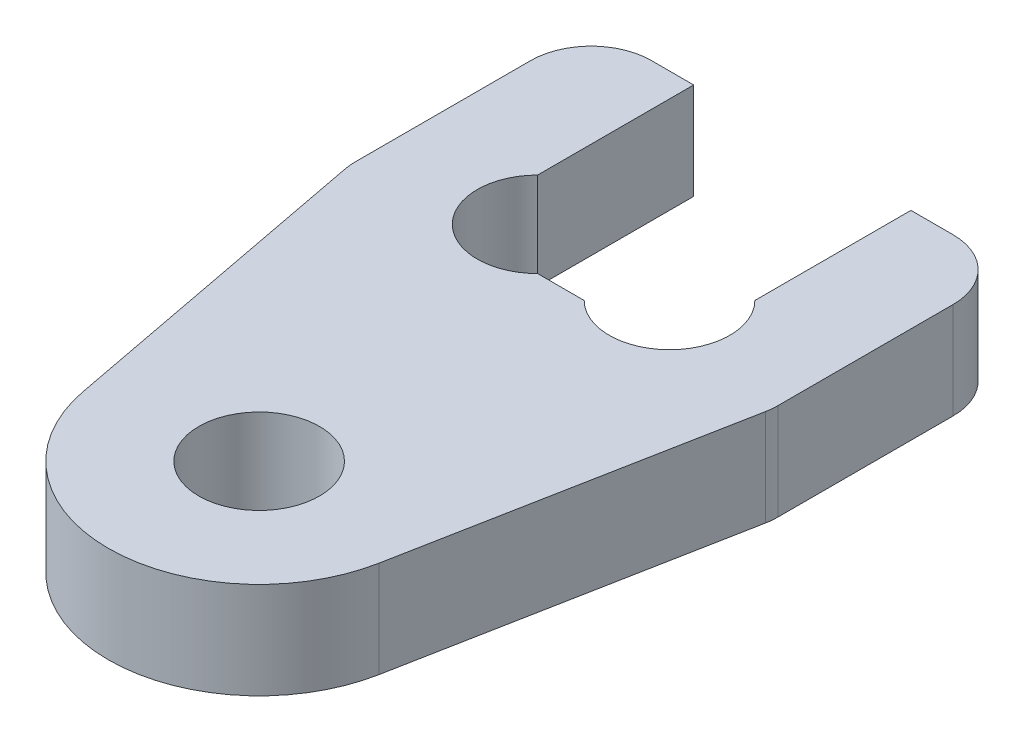
ISO-10303-21;
HEADER;
FILE_DESCRIPTION(('STEP AP214'),'2;1');
FILE_NAME('part.step','',(''),(''),'','','');
FILE_SCHEMA(('AUTOMOTIVE_DESIGN { 1 0 10303 214 1 1 1 1 }'));
ENDSEC;
DATA;
#1=APPLICATION_CONTEXT('core data for automotive mechanical design processes');
#2=APPLICATION_PROTOCOL_DEFINITION('international standard','automotive_design',2000,#1);
#3=PRODUCT_CONTEXT('',#1,'mechanical');
#4=PRODUCT('Part','Part','',(#3));
#5=PRODUCT_RELATED_PRODUCT_CATEGORY('part','',(#4));
#6=PRODUCT_DEFINITION_FORMATION('','',#4);
#7=PRODUCT_DEFINITION_CONTEXT('part definition',#1,'design');
#8=PRODUCT_DEFINITION('design','',#6,#7);
#9=PRODUCT_DEFINITION_SHAPE('','',#8);
#10=(LENGTH_UNIT() NAMED_UNIT(*) SI_UNIT(.MILLI.,.METRE.));
#11=(NAMED_UNIT(*) PLANE_ANGLE_UNIT() SI_UNIT($,.RADIAN.));
#12=(NAMED_UNIT(*) SI_UNIT($,.STERADIAN.) SOLID_ANGLE_UNIT());
#13=UNCERTAINTY_MEASURE_WITH_UNIT(LENGTH_MEASURE(1.E-05),#10,'distance_accuracy_value','');
#14=(GEOMETRIC_REPRESENTATION_CONTEXT(3) GLOBAL_UNCERTAINTY_ASSIGNED_CONTEXT((#13)) GLOBAL_UNIT_ASSIGNED_CONTEXT((#10,
#11,#12)) REPRESENTATION_CONTEXT('',''));
#15=CARTESIAN_POINT('',(0.,0.,0.));
#16=DIRECTION('',(0.,0.,1.));
#17=DIRECTION('',(1.,0.,0.));
#18=AXIS2_PLACEMENT_3D('',#15,#16,#17);
#19=CARTESIAN_POINT('',(-3.5,1.6,-6.));
#20=DIRECTION('',(0.,0.,1.));
#21=DIRECTION('',(1.,0.,0.));
#22=AXIS2_PLACEMENT_3D('',#19,#20,#21);
#23=PLANE('',#22);
#24=DIRECTION('',(-1.,0.,0.));
#25=VECTOR('',#24,1.);
#26=CARTESIAN_POINT('',(-3.5,1.6,-6.));
#27=LINE('',#26,#25);
#28=CARTESIAN_POINT('',(2.49999999999999,1.6,-6.));
#29=VERTEX_POINT('',#28);
#30=CARTESIAN_POINT('',(1.8,1.6,-6.));
#31=VERTEX_POINT('',#30);
#32=EDGE_CURVE('E192',#29,#31,#27,.T.);
#33=ORIENTED_EDGE('',*,*,#32,.F.);
#34=DIRECTION('',(0.,-1.,0.));
#35=VECTOR('',#34,1.);
#36=CARTESIAN_POINT('',(2.49999999999999,1.6,-6.));
#37=LINE('',#36,#35);
#38=CARTESIAN_POINT('',(2.49999999999999,0.,-6.));
#39=VERTEX_POINT('',#38);
#40=EDGE_CURVE('E44',#29,#39,#37,.T.);
#41=ORIENTED_EDGE('',*,*,#40,.T.);
#42=DIRECTION('',(-1.,0.,0.));
#43=VECTOR('',#42,1.);
#44=CARTESIAN_POINT('',(-3.5,0.,-6.));
#45=LINE('',#44,#43);
#46=CARTESIAN_POINT('',(1.8,0.,-6.));
#47=VERTEX_POINT('',#46);
#48=EDGE_CURVE('E188',#39,#47,#45,.T.);
#49=ORIENTED_EDGE('',*,*,#48,.T.);
#50=DIRECTION('',(0.,-1.,0.));
#51=VECTOR('',#50,1.);
#52=CARTESIAN_POINT('',(1.8,1.6,-6.));
#53=LINE('',#52,#51);
#54=EDGE_CURVE('E176',#31,#47,#53,.T.);
#55=ORIENTED_EDGE('',*,*,#54,.F.);
#56=EDGE_LOOP('',(#33,#41,#49,#55));
#57=FACE_BOUND('',#56,.T.);
#58=ADVANCED_FACE('F36',(#57),#23,.F.);
#59=CARTESIAN_POINT('',(-3.5,1.6,-6.));
#60=DIRECTION('',(1.,0.,0.));
#61=DIRECTION('',(0.,0.,-1.));
#62=AXIS2_PLACEMENT_3D('',#59,#60,#61);
#63=PLANE('',#62);
#64=DIRECTION('',(0.,0.,1.));
#65=VECTOR('',#64,1.);
#66=CARTESIAN_POINT('',(-3.5,0.,-6.));
#67=LINE('',#66,#65);
#68=CARTESIAN_POINT('',(-3.5,0.,-5.));
#69=VERTEX_POINT('',#68);
#70=CARTESIAN_POINT('',(-3.5,0.,-2.094627393805));
#71=VERTEX_POINT('',#70);
#72=EDGE_CURVE('E179',#69,#71,#67,.T.);
#73=ORIENTED_EDGE('',*,*,#72,.T.);
#74=DIRECTION('',(0.,1.,0.));
#75=VECTOR('',#74,1.);
#76=CARTESIAN_POINT('',(-3.5,1.6,-2.094627393805));
#77=LINE('',#76,#75);
#78=CARTESIAN_POINT('',(-3.5,1.6,-2.094627393805));
#79=VERTEX_POINT('',#78);
#80=EDGE_CURVE('E211',#71,#79,#77,.T.);
#81=ORIENTED_EDGE('',*,*,#80,.T.);
#82=DIRECTION('',(0.,0.,1.));
#83=VECTOR('',#82,1.);
#84=CARTESIAN_POINT('',(-3.5,1.6,-6.));
#85=LINE('',#84,#83);
#86=CARTESIAN_POINT('',(-3.5,1.6,-5.));
#87=VERTEX_POINT('',#86);
#88=EDGE_CURVE('E184',#87,#79,#85,.T.);
#89=ORIENTED_EDGE('',*,*,#88,.F.);
#90=DIRECTION('',(0.,-1.,0.));
#91=VECTOR('',#90,1.);
#92=CARTESIAN_POINT('',(-3.5,1.6,-5.));
#93=LINE('',#92,#91);
#94=EDGE_CURVE('E194',#87,#69,#93,.T.);
#95=ORIENTED_EDGE('',*,*,#94,.T.);
#96=EDGE_LOOP('',(#73,#81,#89,#95));
#97=FACE_BOUND('',#96,.T.);
#98=ADVANCED_FACE('F277',(#97),#63,.F.);
#99=CARTESIAN_POINT('',(3.49999999999999,1.6,-6.));
#100=DIRECTION('',(-1.,0.,0.));
#101=DIRECTION('',(0.,0.,1.));
#102=AXIS2_PLACEMENT_3D('',#99,#100,#101);
#103=PLANE('',#102);
#104=DIRECTION('',(0.,0.,-1.));
#105=VECTOR('',#104,1.);
#106=CARTESIAN_POINT('',(3.49999999999999,1.6,-6.));
#107=LINE('',#106,#105);
#108=CARTESIAN_POINT('',(3.5,1.6,-2.09462739380498));
#109=VERTEX_POINT('',#108);
#110=CARTESIAN_POINT('',(3.49999999999999,1.6,-5.));
#111=VERTEX_POINT('',#110);
#112=EDGE_CURVE('E187',#109,#111,#107,.T.);
#113=ORIENTED_EDGE('',*,*,#112,.F.);
#114=DIRECTION('',(0.,1.,0.));
#115=VECTOR('',#114,1.);
#116=CARTESIAN_POINT('',(3.5,1.6,-2.09462739380498));
#117=LINE('',#116,#115);
#118=CARTESIAN_POINT('',(3.5,0.,-2.09462739380498));
#119=VERTEX_POINT('',#118);
#120=EDGE_CURVE('E237',#109,#119,#117,.F.);
#121=ORIENTED_EDGE('',*,*,#120,.T.);
#122=DIRECTION('',(0.,0.,-1.));
#123=VECTOR('',#122,1.);
#124=CARTESIAN_POINT('',(3.49999999999999,0.,-6.));
#125=LINE('',#124,#123);
#126=CARTESIAN_POINT('',(3.49999999999999,0.,-5.));
#127=VERTEX_POINT('',#126);
#128=EDGE_CURVE('E197',#119,#127,#125,.T.);
#129=ORIENTED_EDGE('',*,*,#128,.T.);
#130=DIRECTION('',(0.,-1.,0.));
#131=VECTOR('',#130,1.);
#132=CARTESIAN_POINT('',(3.49999999999999,1.6,-5.));
#133=LINE('',#132,#131);
#134=EDGE_CURVE('E235',#127,#111,#133,.F.);
#135=ORIENTED_EDGE('',*,*,#134,.T.);
#136=EDGE_LOOP('',(#113,#121,#129,#135));
#137=FACE_BOUND('',#136,.T.);
#138=ADVANCED_FACE('F327',(#137),#103,.F.);
#139=CARTESIAN_POINT('',(-1.8,0.,-6.));
#140=VERTEX_POINT('',#139);
#141=CARTESIAN_POINT('',(-2.5,0.,-6.));
#142=VERTEX_POINT('',#141);
#143=EDGE_CURVE('E200',#140,#142,#45,.T.);
#144=ORIENTED_EDGE('',*,*,#143,.T.);
#145=DIRECTION('',(0.,-1.,0.));
#146=VECTOR('',#145,1.);
#147=CARTESIAN_POINT('',(-2.5,1.6,-6.));
#148=LINE('',#147,#146);
#149=CARTESIAN_POINT('',(-2.5,1.6,-6.));
#150=VERTEX_POINT('',#149);
#151=EDGE_CURVE('E11',#142,#150,#148,.F.);
#152=ORIENTED_EDGE('',*,*,#151,.T.);
#153=CARTESIAN_POINT('',(-1.8,1.6,-6.));
#154=VERTEX_POINT('',#153);
#155=EDGE_CURVE('E191',#154,#150,#27,.T.);
#156=ORIENTED_EDGE('',*,*,#155,.F.);
#157=DIRECTION('',(0.,-1.,0.));
#158=VECTOR('',#157,1.);
#159=CARTESIAN_POINT('',(-1.8,1.6,-6.));
#160=LINE('',#159,#158);
#161=EDGE_CURVE('E180',#154,#140,#160,.T.);
#162=ORIENTED_EDGE('',*,*,#161,.T.);
#163=EDGE_LOOP('',(#144,#152,#156,#162));
#164=FACE_BOUND('',#163,.T.);
#165=ADVANCED_FACE('F271',(#164),#23,.F.);
#166=CARTESIAN_POINT('',(0.,1.6,0.));
#167=DIRECTION('',(0.,1.,0.));
#168=DIRECTION('',(0.,0.,1.));
#169=AXIS2_PLACEMENT_3D('',#166,#167,#168);
#170=PLANE('',#169);
#171=CARTESIAN_POINT('',(-1.09289321881345,1.6,-2.70710678118655));
#172=DIRECTION('',(0.,1.,0.));
#173=DIRECTION('',(0.,0.,1.));
#174=AXIS2_PLACEMENT_3D('',#171,#172,#173);
#175=CIRCLE('',#174,1.);
#176=CARTESIAN_POINT('',(-1.8,1.6,-3.41421356237309));
#177=VERTEX_POINT('',#176);
#178=CARTESIAN_POINT('',(-0.385786437626905,1.6,-2.));
#179=VERTEX_POINT('',#178);
#180=EDGE_CURVE('E51',#177,#179,#175,.T.);
#181=ORIENTED_EDGE('',*,*,#180,.F.);
#182=DIRECTION('',(0.,0.,-1.));
#183=VECTOR('',#182,1.);
#184=CARTESIAN_POINT('',(-1.8,1.6,-6.));
#185=LINE('',#184,#183);
#186=EDGE_CURVE('E183',#177,#154,#185,.T.);
#187=ORIENTED_EDGE('',*,*,#186,.T.);
#188=ORIENTED_EDGE('',*,*,#155,.T.);
#189=CARTESIAN_POINT('',(-2.5,1.6,-5.));
#190=DIRECTION('',(0.,1.,0.));
#191=DIRECTION('',(0.,0.,1.));
#192=AXIS2_PLACEMENT_3D('',#189,#190,#191);
#193=CIRCLE('',#192,1.);
#194=EDGE_CURVE('E214',#150,#87,#193,.T.);
#195=ORIENTED_EDGE('',*,*,#194,.T.);
#196=ORIENTED_EDGE('',*,*,#88,.T.);
#197=CARTESIAN_POINT('',(-2.5,1.6,-2.094627393805));
#198=DIRECTION('',(0.,1.,0.));
#199=DIRECTION('',(0.,0.,1.));
#200=AXIS2_PLACEMENT_3D('',#197,#198,#199);
#201=CIRCLE('',#200,1.);
#202=CARTESIAN_POINT('',(-3.4822502500443,1.6,-1.90705221877399));
#203=VERTEX_POINT('',#202);
#204=EDGE_CURVE('E220',#79,#203,#201,.T.);
#205=ORIENTED_EDGE('',*,*,#204,.T.);
#206=DIRECTION('',(-0.187575175031009,0.,-0.982250250044298));
#207=VECTOR('',#206,1.);
#208=CARTESIAN_POINT('',(-3.00836291283968,1.6,0.574491276441263));
#209=LINE('',#208,#207);
#210=CARTESIAN_POINT('',(-2.45562562511075,1.6,3.46893793757752));
#211=VERTEX_POINT('',#210);
#212=EDGE_CURVE('E287',#211,#203,#209,.T.);
#213=ORIENTED_EDGE('',*,*,#212,.F.);
#214=CARTESIAN_POINT('',(0.,1.6,3.));
#215=DIRECTION('',(0.,1.,0.));
#216=DIRECTION('',(0.,0.,1.));
#217=AXIS2_PLACEMENT_3D('',#214,#215,#216);
#218=CIRCLE('',#217,2.5);
#219=CARTESIAN_POINT('',(2.45562562511075,1.6,3.46893793757752));
#220=VERTEX_POINT('',#219);
#221=EDGE_CURVE('E205',#220,#211,#218,.F.);
#222=ORIENTED_EDGE('',*,*,#221,.F.);
#223=DIRECTION('',(-0.187575175031009,0.,0.982250250044298));
#224=VECTOR('',#223,1.);
#225=CARTESIAN_POINT('',(3.00836291283968,1.6,0.574491276441262));
#226=LINE('',#225,#224);
#227=CARTESIAN_POINT('',(3.48225025004429,1.6,-1.90705221877397));
#228=VERTEX_POINT('',#227);
#229=EDGE_CURVE('E208',#228,#220,#226,.T.);
#230=ORIENTED_EDGE('',*,*,#229,.F.);
#231=CARTESIAN_POINT('',(2.5,1.6,-2.09462739380498));
#232=DIRECTION('',(0.,1.,0.));
#233=DIRECTION('',(0.,0.,1.));
#234=AXIS2_PLACEMENT_3D('',#231,#232,#233);
#235=CIRCLE('',#234,1.);
#236=EDGE_CURVE('E218',#228,#109,#235,.T.);
#237=ORIENTED_EDGE('',*,*,#236,.T.);
#238=ORIENTED_EDGE('',*,*,#112,.T.);
#239=CARTESIAN_POINT('',(2.49999999999999,1.6,-5.));
#240=DIRECTION('',(0.,1.,0.));
#241=DIRECTION('',(0.,0.,1.));
#242=AXIS2_PLACEMENT_3D('',#239,#240,#241);
#243=CIRCLE('',#242,1.);
#244=EDGE_CURVE('E216',#111,#29,#243,.T.);
#245=ORIENTED_EDGE('',*,*,#244,.T.);
#246=ORIENTED_EDGE('',*,*,#32,.T.);
#247=DIRECTION('',(0.,0.,1.));
#248=VECTOR('',#247,1.);
#249=CARTESIAN_POINT('',(1.8,1.6,-6.));
#250=LINE('',#249,#248);
#251=CARTESIAN_POINT('',(1.8,1.6,-3.41421356237309));
#252=VERTEX_POINT('',#251);
#253=EDGE_CURVE('E169',#31,#252,#250,.T.);
#254=ORIENTED_EDGE('',*,*,#253,.T.);
#255=CARTESIAN_POINT('',(1.09289321881345,1.6,-2.70710678118655));
#256=DIRECTION('',(0.,1.,0.));
#257=DIRECTION('',(0.,0.,-1.));
#258=AXIS2_PLACEMENT_3D('',#255,#256,#257);
#259=CIRCLE('',#258,1.);
#260=CARTESIAN_POINT('',(0.385786437626905,1.6,-2.));
#261=VERTEX_POINT('',#260);
#262=EDGE_CURVE('E308',#261,#252,#259,.T.);
#263=ORIENTED_EDGE('',*,*,#262,.F.);
#264=DIRECTION('',(-1.,0.,0.));
#265=VECTOR('',#264,1.);
#266=CARTESIAN_POINT('',(1.8,1.6,-2.));
#267=LINE('',#266,#265);
#268=EDGE_CURVE('E255',#261,#179,#267,.T.);
#269=ORIENTED_EDGE('',*,*,#268,.T.);
#270=EDGE_LOOP('',(#181,#187,#188,#195,#196,#205,#213,#222,#230,#237,#238,#245,#246,#254,#263,#269));
#271=FACE_BOUND('',#270,.T.);
#272=CARTESIAN_POINT('',(0.,1.6,3.));
#273=DIRECTION('',(0.,1.,0.));
#274=DIRECTION('',(0.,0.,1.));
#275=AXIS2_PLACEMENT_3D('',#272,#273,#274);
#276=CIRCLE('',#275,1.);
#277=CARTESIAN_POINT('',(0.,1.6,4.));
#278=VERTEX_POINT('',#277);
#279=EDGE_CURVE('E204',#278,#278,#276,.T.);
#280=ORIENTED_EDGE('',*,*,#279,.F.);
#281=EDGE_LOOP('',(#280));
#282=FACE_BOUND('',#281,.T.);
#283=ADVANCED_FACE('F263',(#271,#282),#170,.T.);
#284=CARTESIAN_POINT('',(0.,0.,0.));
#285=DIRECTION('',(0.,1.,0.));
#286=DIRECTION('',(0.,0.,1.));
#287=AXIS2_PLACEMENT_3D('',#284,#285,#286);
#288=PLANE('',#287);
#289=CARTESIAN_POINT('',(0.,0.,3.));
#290=DIRECTION('',(0.,1.,0.));
#291=DIRECTION('',(0.,0.,1.));
#292=AXIS2_PLACEMENT_3D('',#289,#290,#291);
#293=CIRCLE('',#292,1.);
#294=CARTESIAN_POINT('',(0.,0.,4.));
#295=VERTEX_POINT('',#294);
#296=EDGE_CURVE('E172',#295,#295,#293,.T.);
#297=ORIENTED_EDGE('',*,*,#296,.T.);
#298=EDGE_LOOP('',(#297));
#299=FACE_BOUND('',#298,.T.);
#300=DIRECTION('',(0.,0.,-1.));
#301=VECTOR('',#300,1.);
#302=CARTESIAN_POINT('',(-1.8,0.,-6.));
#303=LINE('',#302,#301);
#304=CARTESIAN_POINT('',(-1.8,0.,-3.41421356237309));
#305=VERTEX_POINT('',#304);
#306=EDGE_CURVE('E163',#305,#140,#303,.T.);
#307=ORIENTED_EDGE('',*,*,#306,.F.);
#308=CARTESIAN_POINT('',(-1.09289321881345,0.,-2.70710678118655));
#309=DIRECTION('',(0.,1.,0.));
#310=DIRECTION('',(0.,0.,1.));
#311=AXIS2_PLACEMENT_3D('',#308,#309,#310);
#312=CIRCLE('',#311,1.);
#313=CARTESIAN_POINT('',(-0.385786437626905,0.,-2.));
#314=VERTEX_POINT('',#313);
#315=EDGE_CURVE('E149',#305,#314,#312,.T.);
#316=ORIENTED_EDGE('',*,*,#315,.T.);
#317=DIRECTION('',(-1.,0.,0.));
#318=VECTOR('',#317,1.);
#319=CARTESIAN_POINT('',(1.8,0.,-2.));
#320=LINE('',#319,#318);
#321=CARTESIAN_POINT('',(0.385786437626905,0.,-2.));
#322=VERTEX_POINT('',#321);
#323=EDGE_CURVE('E161',#322,#314,#320,.T.);
#324=ORIENTED_EDGE('',*,*,#323,.F.);
#325=CARTESIAN_POINT('',(1.09289321881345,0.,-2.70710678118655));
#326=DIRECTION('',(0.,1.,0.));
#327=DIRECTION('',(0.,0.,-1.));
#328=AXIS2_PLACEMENT_3D('',#325,#326,#327);
#329=CIRCLE('',#328,1.);
#330=CARTESIAN_POINT('',(1.8,0.,-3.41421356237309));
#331=VERTEX_POINT('',#330);
#332=EDGE_CURVE('E59',#322,#331,#329,.T.);
#333=ORIENTED_EDGE('',*,*,#332,.T.);
#334=DIRECTION('',(0.,0.,1.));
#335=VECTOR('',#334,1.);
#336=CARTESIAN_POINT('',(1.8,0.,-6.));
#337=LINE('',#336,#335);
#338=EDGE_CURVE('E167',#47,#331,#337,.T.);
#339=ORIENTED_EDGE('',*,*,#338,.F.);
#340=ORIENTED_EDGE('',*,*,#48,.F.);
#341=CARTESIAN_POINT('',(2.49999999999999,0.,-5.));
#342=DIRECTION('',(0.,1.,0.));
#343=DIRECTION('',(0.,0.,1.));
#344=AXIS2_PLACEMENT_3D('',#341,#342,#343);
#345=CIRCLE('',#344,1.);
#346=EDGE_CURVE('E226',#39,#127,#345,.F.);
#347=ORIENTED_EDGE('',*,*,#346,.T.);
#348=ORIENTED_EDGE('',*,*,#128,.F.);
#349=CARTESIAN_POINT('',(2.5,0.,-2.09462739380498));
#350=DIRECTION('',(0.,1.,0.));
#351=DIRECTION('',(0.,0.,1.));
#352=AXIS2_PLACEMENT_3D('',#349,#350,#351);
#353=CIRCLE('',#352,1.);
#354=CARTESIAN_POINT('',(3.48225025004429,0.,-1.90705221877397));
#355=VERTEX_POINT('',#354);
#356=EDGE_CURVE('E228',#119,#355,#353,.F.);
#357=ORIENTED_EDGE('',*,*,#356,.T.);
#358=DIRECTION('',(-0.187575175031009,0.,0.982250250044298));
#359=VECTOR('',#358,1.);
#360=CARTESIAN_POINT('',(2.45562562511075,0.,3.46893793757752));
#361=LINE('',#360,#359);
#362=CARTESIAN_POINT('',(2.45562562511075,0.,3.46893793757752));
#363=VERTEX_POINT('',#362);
#364=EDGE_CURVE('E298',#355,#363,#361,.T.);
#365=ORIENTED_EDGE('',*,*,#364,.T.);
#366=CARTESIAN_POINT('',(0.,0.,3.));
#367=DIRECTION('',(0.,-1.,0.));
#368=DIRECTION('',(0.,0.,-1.));
#369=AXIS2_PLACEMENT_3D('',#366,#367,#368);
#370=CIRCLE('',#369,2.5);
#371=CARTESIAN_POINT('',(-2.45562562511075,0.,3.46893793757752));
#372=VERTEX_POINT('',#371);
#373=EDGE_CURVE('E303',#363,#372,#370,.T.);
#374=ORIENTED_EDGE('',*,*,#373,.T.);
#375=DIRECTION('',(-0.187575175031009,0.,-0.982250250044298));
#376=VECTOR('',#375,1.);
#377=CARTESIAN_POINT('',(-2.45562562511075,0.,3.46893793757752));
#378=LINE('',#377,#376);
#379=CARTESIAN_POINT('',(-3.4822502500443,0.,-1.90705221877399));
#380=VERTEX_POINT('',#379);
#381=EDGE_CURVE('E301',#372,#380,#378,.T.);
#382=ORIENTED_EDGE('',*,*,#381,.T.);
#383=CARTESIAN_POINT('',(-2.5,0.,-2.094627393805));
#384=DIRECTION('',(0.,1.,0.));
#385=DIRECTION('',(0.,0.,1.));
#386=AXIS2_PLACEMENT_3D('',#383,#384,#385);
#387=CIRCLE('',#386,1.);
#388=EDGE_CURVE('E230',#380,#71,#387,.F.);
#389=ORIENTED_EDGE('',*,*,#388,.T.);
#390=ORIENTED_EDGE('',*,*,#72,.F.);
#391=CARTESIAN_POINT('',(-2.5,0.,-5.));
#392=DIRECTION('',(0.,1.,0.));
#393=DIRECTION('',(0.,0.,1.));
#394=AXIS2_PLACEMENT_3D('',#391,#392,#393);
#395=CIRCLE('',#394,1.);
#396=EDGE_CURVE('E224',#69,#142,#395,.F.);
#397=ORIENTED_EDGE('',*,*,#396,.T.);
#398=ORIENTED_EDGE('',*,*,#143,.F.);
#399=EDGE_LOOP('',(#307,#316,#324,#333,#339,#340,#347,#348,#357,#365,#374,#382,#389,#390,#397,#398));
#400=FACE_BOUND('',#399,.T.);
#401=ADVANCED_FACE('F160',(#299,#400),#288,.F.);
#402=CARTESIAN_POINT('',(1.8,1.6,-6.));
#403=DIRECTION('',(1.,0.,0.));
#404=DIRECTION('',(0.,0.,-1.));
#405=AXIS2_PLACEMENT_3D('',#402,#403,#404);
#406=PLANE('',#405);
#407=ORIENTED_EDGE('',*,*,#338,.T.);
#408=DIRECTION('',(0.,1.,0.));
#409=VECTOR('',#408,1.);
#410=CARTESIAN_POINT('',(1.8,0.,-3.41421356237309));
#411=LINE('',#410,#409);
#412=EDGE_CURVE('E252',#331,#252,#411,.T.);
#413=ORIENTED_EDGE('',*,*,#412,.T.);
#414=ORIENTED_EDGE('',*,*,#253,.F.);
#415=ORIENTED_EDGE('',*,*,#54,.T.);
#416=EDGE_LOOP('',(#407,#413,#414,#415));
#417=FACE_BOUND('',#416,.T.);
#418=ADVANCED_FACE('F250',(#417),#406,.F.);
#419=CARTESIAN_POINT('',(-1.8,1.6,-6.));
#420=DIRECTION('',(-1.,0.,0.));
#421=DIRECTION('',(0.,0.,1.));
#422=AXIS2_PLACEMENT_3D('',#419,#420,#421);
#423=PLANE('',#422);
#424=ORIENTED_EDGE('',*,*,#186,.F.);
#425=DIRECTION('',(0.,1.,0.));
#426=VECTOR('',#425,1.);
#427=CARTESIAN_POINT('',(-1.8,0.,-3.41421356237309));
#428=LINE('',#427,#426);
#429=EDGE_CURVE('E155',#305,#177,#428,.T.);
#430=ORIENTED_EDGE('',*,*,#429,.F.);
#431=ORIENTED_EDGE('',*,*,#306,.T.);
#432=ORIENTED_EDGE('',*,*,#161,.F.);
#433=EDGE_LOOP('',(#424,#430,#431,#432));
#434=FACE_BOUND('',#433,.T.);
#435=ADVANCED_FACE('F268',(#434),#423,.F.);
#436=CARTESIAN_POINT('',(1.8,1.6,-2.));
#437=DIRECTION('',(0.,0.,1.));
#438=DIRECTION('',(1.,0.,0.));
#439=AXIS2_PLACEMENT_3D('',#436,#437,#438);
#440=PLANE('',#439);
#441=ORIENTED_EDGE('',*,*,#323,.T.);
#442=DIRECTION('',(0.,1.,0.));
#443=VECTOR('',#442,1.);
#444=CARTESIAN_POINT('',(-0.385786437626905,0.,-2.));
#445=LINE('',#444,#443);
#446=EDGE_CURVE('E146',#314,#179,#445,.T.);
#447=ORIENTED_EDGE('',*,*,#446,.T.);
#448=ORIENTED_EDGE('',*,*,#268,.F.);
#449=DIRECTION('',(0.,1.,0.));
#450=VECTOR('',#449,1.);
#451=CARTESIAN_POINT('',(0.385786437626905,0.,-2.));
#452=LINE('',#451,#450);
#453=EDGE_CURVE('E166',#322,#261,#452,.T.);
#454=ORIENTED_EDGE('',*,*,#453,.F.);
#455=EDGE_LOOP('',(#441,#447,#448,#454));
#456=FACE_BOUND('',#455,.T.);
#457=ADVANCED_FACE('F165',(#456),#440,.F.);
#458=CARTESIAN_POINT('',(0.,-8.4,3.));
#459=DIRECTION('',(0.,1.,0.));
#460=DIRECTION('',(0.,0.,1.));
#461=AXIS2_PLACEMENT_3D('',#458,#459,#460);
#462=CYLINDRICAL_SURFACE('',#461,1.);
#463=ORIENTED_EDGE('',*,*,#279,.T.);
#464=EDGE_LOOP('',(#463));
#465=FACE_BOUND('',#464,.T.);
#466=ORIENTED_EDGE('',*,*,#296,.F.);
#467=EDGE_LOOP('',(#466));
#468=FACE_BOUND('',#467,.T.);
#469=ADVANCED_FACE('F363',(#465,#468),#462,.F.);
#470=CARTESIAN_POINT('',(0.,0.,3.));
#471=DIRECTION('',(0.,1.,0.));
#472=DIRECTION('',(0.,0.,1.));
#473=AXIS2_PLACEMENT_3D('',#470,#471,#472);
#474=CYLINDRICAL_SURFACE('',#473,2.5);
#475=ORIENTED_EDGE('',*,*,#221,.T.);
#476=DIRECTION('',(0.,1.,0.));
#477=VECTOR('',#476,1.);
#478=CARTESIAN_POINT('',(-2.45562562511075,0.,3.46893793757752));
#479=LINE('',#478,#477);
#480=EDGE_CURVE('E292',#372,#211,#479,.T.);
#481=ORIENTED_EDGE('',*,*,#480,.F.);
#482=ORIENTED_EDGE('',*,*,#373,.F.);
#483=DIRECTION('',(0.,1.,0.));
#484=VECTOR('',#483,1.);
#485=CARTESIAN_POINT('',(2.45562562511075,0.,3.46893793757752));
#486=LINE('',#485,#484);
#487=EDGE_CURVE('E293',#363,#220,#486,.T.);
#488=ORIENTED_EDGE('',*,*,#487,.T.);
#489=EDGE_LOOP('',(#475,#481,#482,#488));
#490=FACE_BOUND('',#489,.T.);
#491=ADVANCED_FACE('F361',(#490),#474,.T.);
#492=CARTESIAN_POINT('',(2.45562562511075,0.,3.46893793757752));
#493=DIRECTION('',(-0.982250250044298,0.,-0.187575175031009));
#494=DIRECTION('',(-0.187575175031009,0.,0.982250250044298));
#495=AXIS2_PLACEMENT_3D('',#492,#493,#494);
#496=PLANE('',#495);
#497=ORIENTED_EDGE('',*,*,#364,.F.);
#498=DIRECTION('',(0.,1.,0.));
#499=VECTOR('',#498,1.);
#500=CARTESIAN_POINT('',(3.48225025004429,0.,-1.90705221877397));
#501=LINE('',#500,#499);
#502=EDGE_CURVE('E232',#355,#228,#501,.T.);
#503=ORIENTED_EDGE('',*,*,#502,.T.);
#504=ORIENTED_EDGE('',*,*,#229,.T.);
#505=ORIENTED_EDGE('',*,*,#487,.F.);
#506=EDGE_LOOP('',(#497,#503,#504,#505));
#507=FACE_BOUND('',#506,.T.);
#508=ADVANCED_FACE('F358',(#507),#496,.F.);
#509=CARTESIAN_POINT('',(-2.45562562511075,0.,3.46893793757752));
#510=DIRECTION('',(0.982250250044298,0.,-0.187575175031009));
#511=DIRECTION('',(-0.187575175031009,0.,-0.982250250044298));
#512=AXIS2_PLACEMENT_3D('',#509,#510,#511);
#513=PLANE('',#512);
#514=ORIENTED_EDGE('',*,*,#212,.T.);
#515=DIRECTION('',(0.,1.,0.));
#516=VECTOR('',#515,1.);
#517=CARTESIAN_POINT('',(-3.4822502500443,0.,-1.90705221877399));
#518=LINE('',#517,#516);
#519=EDGE_CURVE('E222',#203,#380,#518,.F.);
#520=ORIENTED_EDGE('',*,*,#519,.T.);
#521=ORIENTED_EDGE('',*,*,#381,.F.);
#522=ORIENTED_EDGE('',*,*,#480,.T.);
#523=EDGE_LOOP('',(#514,#520,#521,#522));
#524=FACE_BOUND('',#523,.T.);
#525=ADVANCED_FACE('F289',(#524),#513,.F.);
#526=CARTESIAN_POINT('',(-2.5,1.6,-2.094627393805));
#527=DIRECTION('',(0.,1.,0.));
#528=DIRECTION('',(0.,0.,1.));
#529=AXIS2_PLACEMENT_3D('',#526,#527,#528);
#530=CYLINDRICAL_SURFACE('',#529,1.);
#531=ORIENTED_EDGE('',*,*,#388,.F.);
#532=ORIENTED_EDGE('',*,*,#519,.F.);
#533=ORIENTED_EDGE('',*,*,#204,.F.);
#534=ORIENTED_EDGE('',*,*,#80,.F.);
#535=EDGE_LOOP('',(#531,#532,#533,#534));
#536=FACE_BOUND('',#535,.T.);
#537=ADVANCED_FACE('F282',(#536),#530,.T.);
#538=CARTESIAN_POINT('',(2.5,0.,-2.09462739380498));
#539=DIRECTION('',(0.,1.,0.));
#540=DIRECTION('',(0.,0.,1.));
#541=AXIS2_PLACEMENT_3D('',#538,#539,#540);
#542=CYLINDRICAL_SURFACE('',#541,1.);
#543=ORIENTED_EDGE('',*,*,#356,.F.);
#544=ORIENTED_EDGE('',*,*,#120,.F.);
#545=ORIENTED_EDGE('',*,*,#236,.F.);
#546=ORIENTED_EDGE('',*,*,#502,.F.);
#547=EDGE_LOOP('',(#543,#544,#545,#546));
#548=FACE_BOUND('',#547,.T.);
#549=ADVANCED_FACE('F344',(#548),#542,.T.);
#550=CARTESIAN_POINT('',(2.49999999999999,1.6,-5.));
#551=DIRECTION('',(0.,-1.,0.));
#552=DIRECTION('',(0.,0.,-1.));
#553=AXIS2_PLACEMENT_3D('',#550,#551,#552);
#554=CYLINDRICAL_SURFACE('',#553,1.);
#555=ORIENTED_EDGE('',*,*,#244,.F.);
#556=ORIENTED_EDGE('',*,*,#134,.F.);
#557=ORIENTED_EDGE('',*,*,#346,.F.);
#558=ORIENTED_EDGE('',*,*,#40,.F.);
#559=EDGE_LOOP('',(#555,#556,#557,#558));
#560=FACE_BOUND('',#559,.T.);
#561=ADVANCED_FACE('F320',(#560),#554,.T.);
#562=CARTESIAN_POINT('',(-2.5,1.6,-5.));
#563=DIRECTION('',(0.,-1.,0.));
#564=DIRECTION('',(0.,0.,-1.));
#565=AXIS2_PLACEMENT_3D('',#562,#563,#564);
#566=CYLINDRICAL_SURFACE('',#565,1.);
#567=ORIENTED_EDGE('',*,*,#194,.F.);
#568=ORIENTED_EDGE('',*,*,#151,.F.);
#569=ORIENTED_EDGE('',*,*,#396,.F.);
#570=ORIENTED_EDGE('',*,*,#94,.F.);
#571=EDGE_LOOP('',(#567,#568,#569,#570));
#572=FACE_BOUND('',#571,.T.);
#573=ADVANCED_FACE('F38',(#572),#566,.T.);
#574=CARTESIAN_POINT('',(1.09289321881345,0.,-2.70710678118655));
#575=DIRECTION('',(0.,1.,0.));
#576=DIRECTION('',(0.,0.,1.));
#577=AXIS2_PLACEMENT_3D('',#574,#575,#576);
#578=CYLINDRICAL_SURFACE('',#577,1.);
#579=ORIENTED_EDGE('',*,*,#332,.F.);
#580=ORIENTED_EDGE('',*,*,#453,.T.);
#581=ORIENTED_EDGE('',*,*,#262,.T.);
#582=ORIENTED_EDGE('',*,*,#412,.F.);
#583=EDGE_LOOP('',(#579,#580,#581,#582));
#584=FACE_BOUND('',#583,.T.);
#585=ADVANCED_FACE('F312',(#584),#578,.F.);
#586=CARTESIAN_POINT('',(-1.09289321881345,0.,-2.70710678118655));
#587=DIRECTION('',(0.,1.,0.));
#588=DIRECTION('',(0.,0.,1.));
#589=AXIS2_PLACEMENT_3D('',#586,#587,#588);
#590=CYLINDRICAL_SURFACE('',#589,1.);
#591=ORIENTED_EDGE('',*,*,#180,.T.);
#592=ORIENTED_EDGE('',*,*,#446,.F.);
#593=ORIENTED_EDGE('',*,*,#315,.F.);
#594=ORIENTED_EDGE('',*,*,#429,.T.);
#595=EDGE_LOOP('',(#591,#592,#593,#594));
#596=FACE_BOUND('',#595,.T.);
#597=ADVANCED_FACE('F148',(#596),#590,.F.);
#598=CLOSED_SHELL('',(#58,#98,#138,#165,#283,#401,#418,#435,#457,#469,#491,#508,#525,#537,#549,
#561,#573,#585,#597));
#599=MANIFOLD_SOLID_BREP('B2',#598);
#600=ADVANCED_BREP_SHAPE_REPRESENTATION('',(#18,#599),#14);
#601=SHAPE_DEFINITION_REPRESENTATION(#9,#600);
ENDSEC;
END-ISO-10303-21;
